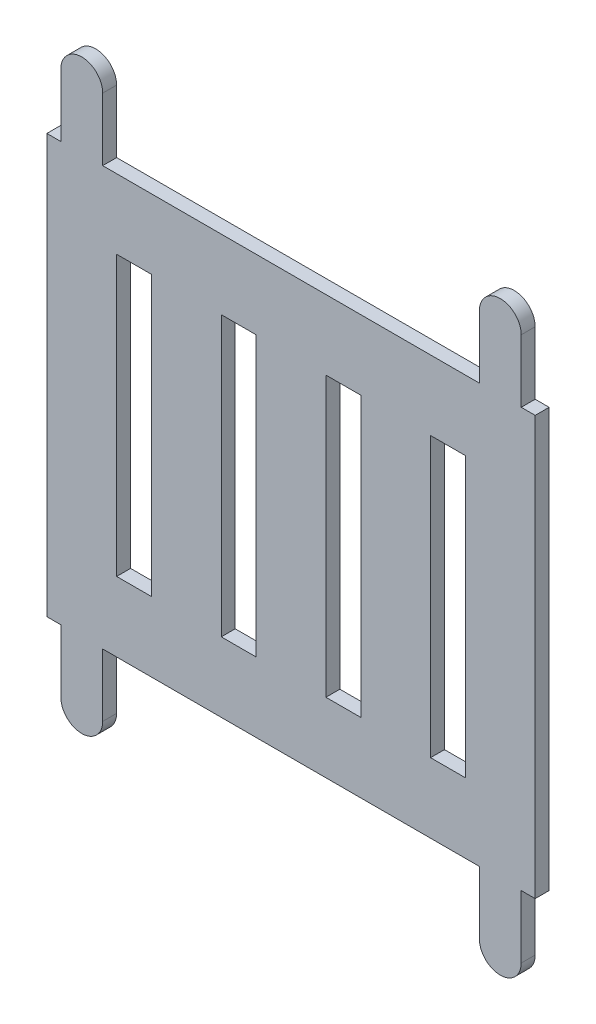
ISO-10303-21;
HEADER;
FILE_DESCRIPTION(('STEP AP214'),'2;1');
FILE_NAME('part.step','',(''),(''),'','','');
FILE_SCHEMA(('AUTOMOTIVE_DESIGN { 1 0 10303 214 1 1 1 1 }'));
ENDSEC;
DATA;
#1=APPLICATION_CONTEXT('core data for automotive mechanical design processes');
#2=APPLICATION_PROTOCOL_DEFINITION('international standard','automotive_design',2000,#1);
#3=PRODUCT_CONTEXT('',#1,'mechanical');
#4=PRODUCT('Part','Part','',(#3));
#5=PRODUCT_RELATED_PRODUCT_CATEGORY('part','',(#4));
#6=PRODUCT_DEFINITION_FORMATION('','',#4);
#7=PRODUCT_DEFINITION_CONTEXT('part definition',#1,'design');
#8=PRODUCT_DEFINITION('design','',#6,#7);
#9=PRODUCT_DEFINITION_SHAPE('','',#8);
#10=(LENGTH_UNIT() NAMED_UNIT(*) SI_UNIT(.MILLI.,.METRE.));
#11=(NAMED_UNIT(*) PLANE_ANGLE_UNIT() SI_UNIT($,.RADIAN.));
#12=(NAMED_UNIT(*) SI_UNIT($,.STERADIAN.) SOLID_ANGLE_UNIT());
#13=UNCERTAINTY_MEASURE_WITH_UNIT(LENGTH_MEASURE(1.E-05),#10,'distance_accuracy_value','');
#14=(GEOMETRIC_REPRESENTATION_CONTEXT(3) GLOBAL_UNCERTAINTY_ASSIGNED_CONTEXT((#13)) GLOBAL_UNIT_ASSIGNED_CONTEXT((#10,
#11,#12)) REPRESENTATION_CONTEXT('',''));
#15=CARTESIAN_POINT('',(0.,0.,0.));
#16=DIRECTION('',(0.,0.,1.));
#17=DIRECTION('',(1.,0.,0.));
#18=AXIS2_PLACEMENT_3D('',#15,#16,#17);
#19=CARTESIAN_POINT('',(5.,69.,1.));
#20=DIRECTION('',(0.,0.,-1.));
#21=DIRECTION('',(-1.,0.,0.));
#22=AXIS2_PLACEMENT_3D('',#19,#20,#21);
#23=PLANE('',#22);
#24=DIRECTION('',(0.,-1.,0.));
#25=VECTOR('',#24,1.);
#26=CARTESIAN_POINT('',(55.,50.,1.));
#27=LINE('',#26,#25);
#28=CARTESIAN_POINT('',(55.,50.,1.));
#29=VERTEX_POINT('',#28);
#30=CARTESIAN_POINT('',(55.,10.,1.));
#31=VERTEX_POINT('',#30);
#32=EDGE_CURVE('E303',#29,#31,#27,.T.);
#33=ORIENTED_EDGE('',*,*,#32,.F.);
#34=DIRECTION('',(-1.,0.,0.));
#35=VECTOR('',#34,1.);
#36=CARTESIAN_POINT('',(55.,50.,1.));
#37=LINE('',#36,#35);
#38=CARTESIAN_POINT('',(60.,50.,1.));
#39=VERTEX_POINT('',#38);
#40=EDGE_CURVE('E311',#39,#29,#37,.T.);
#41=ORIENTED_EDGE('',*,*,#40,.F.);
#42=DIRECTION('',(0.,1.,0.));
#43=VECTOR('',#42,1.);
#44=CARTESIAN_POINT('',(60.,50.,1.));
#45=LINE('',#44,#43);
#46=CARTESIAN_POINT('',(60.,10.,1.));
#47=VERTEX_POINT('',#46);
#48=EDGE_CURVE('E308',#47,#39,#45,.T.);
#49=ORIENTED_EDGE('',*,*,#48,.F.);
#50=DIRECTION('',(1.,0.,0.));
#51=VECTOR('',#50,1.);
#52=CARTESIAN_POINT('',(55.,10.,1.));
#53=LINE('',#52,#51);
#54=EDGE_CURVE('E305',#31,#47,#53,.T.);
#55=ORIENTED_EDGE('',*,*,#54,.F.);
#56=EDGE_LOOP('',(#33,#41,#49,#55));
#57=FACE_BOUND('',#56,.T.);
#58=DIRECTION('',(0.,1.,0.));
#59=VECTOR('',#58,1.);
#60=CARTESIAN_POINT('',(30.,50.,1.));
#61=LINE('',#60,#59);
#62=CARTESIAN_POINT('',(30.,10.,1.));
#63=VERTEX_POINT('',#62);
#64=CARTESIAN_POINT('',(30.,50.,1.));
#65=VERTEX_POINT('',#64);
#66=EDGE_CURVE('E365',#63,#65,#61,.T.);
#67=ORIENTED_EDGE('',*,*,#66,.F.);
#68=DIRECTION('',(1.,0.,0.));
#69=VECTOR('',#68,1.);
#70=CARTESIAN_POINT('',(30.,10.,1.));
#71=LINE('',#70,#69);
#72=CARTESIAN_POINT('',(25.,10.,1.));
#73=VERTEX_POINT('',#72);
#74=EDGE_CURVE('E373',#73,#63,#71,.T.);
#75=ORIENTED_EDGE('',*,*,#74,.F.);
#76=DIRECTION('',(0.,-1.,0.));
#77=VECTOR('',#76,1.);
#78=CARTESIAN_POINT('',(25.,50.,1.));
#79=LINE('',#78,#77);
#80=CARTESIAN_POINT('',(25.,50.,1.));
#81=VERTEX_POINT('',#80);
#82=EDGE_CURVE('E370',#81,#73,#79,.T.);
#83=ORIENTED_EDGE('',*,*,#82,.F.);
#84=DIRECTION('',(-1.,0.,0.));
#85=VECTOR('',#84,1.);
#86=CARTESIAN_POINT('',(30.,50.,1.));
#87=LINE('',#86,#85);
#88=EDGE_CURVE('E367',#65,#81,#87,.T.);
#89=ORIENTED_EDGE('',*,*,#88,.F.);
#90=EDGE_LOOP('',(#67,#75,#83,#89));
#91=FACE_BOUND('',#90,.T.);
#92=DIRECTION('',(0.,-1.,0.));
#93=VECTOR('',#92,1.);
#94=CARTESIAN_POINT('',(0.,0.,1.));
#95=LINE('',#94,#93);
#96=CARTESIAN_POINT('',(0.,60.,1.));
#97=VERTEX_POINT('',#96);
#98=CARTESIAN_POINT('',(0.,0.,1.));
#99=VERTEX_POINT('',#98);
#100=EDGE_CURVE('E396',#97,#99,#95,.T.);
#101=ORIENTED_EDGE('',*,*,#100,.T.);
#102=DIRECTION('',(1.,0.,0.));
#103=VECTOR('',#102,1.);
#104=CARTESIAN_POINT('',(0.,0.,1.));
#105=LINE('',#104,#103);
#106=CARTESIAN_POINT('',(2.,0.,1.));
#107=VERTEX_POINT('',#106);
#108=EDGE_CURVE('E399',#99,#107,#105,.T.);
#109=ORIENTED_EDGE('',*,*,#108,.T.);
#110=DIRECTION('',(0.,-1.,0.));
#111=VECTOR('',#110,1.);
#112=CARTESIAN_POINT('',(2.,0.,1.));
#113=LINE('',#112,#111);
#114=CARTESIAN_POINT('',(2.,-9.,1.));
#115=VERTEX_POINT('',#114);
#116=EDGE_CURVE('E402',#107,#115,#113,.T.);
#117=ORIENTED_EDGE('',*,*,#116,.T.);
#118=CARTESIAN_POINT('',(5.,-9.,1.));
#119=DIRECTION('',(0.,0.,1.));
#120=DIRECTION('',(1.,0.,0.));
#121=AXIS2_PLACEMENT_3D('',#118,#119,#120);
#122=CIRCLE('',#121,3.);
#123=CARTESIAN_POINT('',(8.,-9.,1.));
#124=VERTEX_POINT('',#123);
#125=EDGE_CURVE('E404',#115,#124,#122,.T.);
#126=ORIENTED_EDGE('',*,*,#125,.T.);
#127=DIRECTION('',(0.,1.,0.));
#128=VECTOR('',#127,1.);
#129=CARTESIAN_POINT('',(8.,-9.,1.));
#130=LINE('',#129,#128);
#131=CARTESIAN_POINT('',(8.,0.,1.));
#132=VERTEX_POINT('',#131);
#133=EDGE_CURVE('E406',#124,#132,#130,.T.);
#134=ORIENTED_EDGE('',*,*,#133,.T.);
#135=DIRECTION('',(1.,0.,0.));
#136=VECTOR('',#135,1.);
#137=CARTESIAN_POINT('',(8.,0.,1.));
#138=LINE('',#137,#136);
#139=CARTESIAN_POINT('',(62.,0.,1.));
#140=VERTEX_POINT('',#139);
#141=EDGE_CURVE('E408',#132,#140,#138,.T.);
#142=ORIENTED_EDGE('',*,*,#141,.T.);
#143=DIRECTION('',(0.,-1.,0.));
#144=VECTOR('',#143,1.);
#145=CARTESIAN_POINT('',(62.,0.,1.));
#146=LINE('',#145,#144);
#147=CARTESIAN_POINT('',(62.,-9.,1.));
#148=VERTEX_POINT('',#147);
#149=EDGE_CURVE('E410',#140,#148,#146,.T.);
#150=ORIENTED_EDGE('',*,*,#149,.T.);
#151=CARTESIAN_POINT('',(65.,-8.99999999999999,1.));
#152=DIRECTION('',(0.,0.,1.));
#153=DIRECTION('',(1.,0.,0.));
#154=AXIS2_PLACEMENT_3D('',#151,#152,#153);
#155=CIRCLE('',#154,3.);
#156=CARTESIAN_POINT('',(68.,-8.99999999999999,1.));
#157=VERTEX_POINT('',#156);
#158=EDGE_CURVE('E412',#148,#157,#155,.T.);
#159=ORIENTED_EDGE('',*,*,#158,.T.);
#160=DIRECTION('',(0.,1.,0.));
#161=VECTOR('',#160,1.);
#162=CARTESIAN_POINT('',(68.,-9.,1.));
#163=LINE('',#162,#161);
#164=CARTESIAN_POINT('',(68.,0.,1.));
#165=VERTEX_POINT('',#164);
#166=EDGE_CURVE('E414',#157,#165,#163,.T.);
#167=ORIENTED_EDGE('',*,*,#166,.T.);
#168=DIRECTION('',(1.,0.,0.));
#169=VECTOR('',#168,1.);
#170=CARTESIAN_POINT('',(68.,0.,1.));
#171=LINE('',#170,#169);
#172=CARTESIAN_POINT('',(70.,0.,1.));
#173=VERTEX_POINT('',#172);
#174=EDGE_CURVE('E416',#165,#173,#171,.T.);
#175=ORIENTED_EDGE('',*,*,#174,.T.);
#176=DIRECTION('',(0.,1.,0.));
#177=VECTOR('',#176,1.);
#178=CARTESIAN_POINT('',(70.,0.,1.));
#179=LINE('',#178,#177);
#180=CARTESIAN_POINT('',(70.,60.,1.));
#181=VERTEX_POINT('',#180);
#182=EDGE_CURVE('E418',#173,#181,#179,.T.);
#183=ORIENTED_EDGE('',*,*,#182,.T.);
#184=DIRECTION('',(-1.,0.,0.));
#185=VECTOR('',#184,1.);
#186=CARTESIAN_POINT('',(68.,60.,1.));
#187=LINE('',#186,#185);
#188=CARTESIAN_POINT('',(68.,60.,1.));
#189=VERTEX_POINT('',#188);
#190=EDGE_CURVE('E420',#181,#189,#187,.T.);
#191=ORIENTED_EDGE('',*,*,#190,.T.);
#192=DIRECTION('',(0.,1.,0.));
#193=VECTOR('',#192,1.);
#194=CARTESIAN_POINT('',(68.,69.,1.));
#195=LINE('',#194,#193);
#196=CARTESIAN_POINT('',(68.,69.,1.));
#197=VERTEX_POINT('',#196);
#198=EDGE_CURVE('E422',#189,#197,#195,.T.);
#199=ORIENTED_EDGE('',*,*,#198,.T.);
#200=CARTESIAN_POINT('',(65.,69.,1.));
#201=DIRECTION('',(0.,0.,1.));
#202=DIRECTION('',(-1.,0.,0.));
#203=AXIS2_PLACEMENT_3D('',#200,#201,#202);
#204=CIRCLE('',#203,3.);
#205=CARTESIAN_POINT('',(62.,69.,1.));
#206=VERTEX_POINT('',#205);
#207=EDGE_CURVE('E424',#197,#206,#204,.T.);
#208=ORIENTED_EDGE('',*,*,#207,.T.);
#209=DIRECTION('',(0.,-1.,0.));
#210=VECTOR('',#209,1.);
#211=CARTESIAN_POINT('',(62.,60.,1.));
#212=LINE('',#211,#210);
#213=CARTESIAN_POINT('',(62.,60.,1.));
#214=VERTEX_POINT('',#213);
#215=EDGE_CURVE('E426',#206,#214,#212,.T.);
#216=ORIENTED_EDGE('',*,*,#215,.T.);
#217=DIRECTION('',(-1.,0.,0.));
#218=VECTOR('',#217,1.);
#219=CARTESIAN_POINT('',(8.,60.,1.));
#220=LINE('',#219,#218);
#221=CARTESIAN_POINT('',(8.,60.,1.));
#222=VERTEX_POINT('',#221);
#223=EDGE_CURVE('E428',#214,#222,#220,.T.);
#224=ORIENTED_EDGE('',*,*,#223,.T.);
#225=DIRECTION('',(0.,1.,0.));
#226=VECTOR('',#225,1.);
#227=CARTESIAN_POINT('',(8.,69.,1.));
#228=LINE('',#227,#226);
#229=CARTESIAN_POINT('',(8.,69.,1.));
#230=VERTEX_POINT('',#229);
#231=EDGE_CURVE('E430',#222,#230,#228,.T.);
#232=ORIENTED_EDGE('',*,*,#231,.T.);
#233=CARTESIAN_POINT('',(5.,69.,1.));
#234=DIRECTION('',(0.,0.,1.));
#235=DIRECTION('',(-1.,0.,0.));
#236=AXIS2_PLACEMENT_3D('',#233,#234,#235);
#237=CIRCLE('',#236,3.);
#238=CARTESIAN_POINT('',(2.,69.,1.));
#239=VERTEX_POINT('',#238);
#240=EDGE_CURVE('E432',#230,#239,#237,.T.);
#241=ORIENTED_EDGE('',*,*,#240,.T.);
#242=DIRECTION('',(0.,-1.,0.));
#243=VECTOR('',#242,1.);
#244=CARTESIAN_POINT('',(2.,60.,1.));
#245=LINE('',#244,#243);
#246=CARTESIAN_POINT('',(2.,60.,1.));
#247=VERTEX_POINT('',#246);
#248=EDGE_CURVE('E434',#239,#247,#245,.T.);
#249=ORIENTED_EDGE('',*,*,#248,.T.);
#250=DIRECTION('',(-1.,0.,0.));
#251=VECTOR('',#250,1.);
#252=CARTESIAN_POINT('',(0.,60.,1.));
#253=LINE('',#252,#251);
#254=EDGE_CURVE('E436',#247,#97,#253,.T.);
#255=ORIENTED_EDGE('',*,*,#254,.T.);
#256=EDGE_LOOP('',(#101,#109,#117,#126,#134,#142,#150,#159,#167,#175,#183,#191,#199,#208,#216,
#224,#232,#241,#249,#255));
#257=FACE_BOUND('',#256,.T.);
#258=DIRECTION('',(0.,-1.,0.));
#259=VECTOR('',#258,1.);
#260=CARTESIAN_POINT('',(40.,50.,1.));
#261=LINE('',#260,#259);
#262=CARTESIAN_POINT('',(40.,50.,1.));
#263=VERTEX_POINT('',#262);
#264=CARTESIAN_POINT('',(40.,10.,1.));
#265=VERTEX_POINT('',#264);
#266=EDGE_CURVE('E334',#263,#265,#261,.T.);
#267=ORIENTED_EDGE('',*,*,#266,.F.);
#268=DIRECTION('',(-1.,0.,0.));
#269=VECTOR('',#268,1.);
#270=CARTESIAN_POINT('',(40.,50.,1.));
#271=LINE('',#270,#269);
#272=CARTESIAN_POINT('',(45.,50.,1.));
#273=VERTEX_POINT('',#272);
#274=EDGE_CURVE('E342',#273,#263,#271,.T.);
#275=ORIENTED_EDGE('',*,*,#274,.F.);
#276=DIRECTION('',(0.,1.,0.));
#277=VECTOR('',#276,1.);
#278=CARTESIAN_POINT('',(45.,50.,1.));
#279=LINE('',#278,#277);
#280=CARTESIAN_POINT('',(45.,10.,1.));
#281=VERTEX_POINT('',#280);
#282=EDGE_CURVE('E339',#281,#273,#279,.T.);
#283=ORIENTED_EDGE('',*,*,#282,.F.);
#284=DIRECTION('',(1.,0.,0.));
#285=VECTOR('',#284,1.);
#286=CARTESIAN_POINT('',(40.,10.,1.));
#287=LINE('',#286,#285);
#288=EDGE_CURVE('E336',#265,#281,#287,.T.);
#289=ORIENTED_EDGE('',*,*,#288,.F.);
#290=EDGE_LOOP('',(#267,#275,#283,#289));
#291=FACE_BOUND('',#290,.T.);
#292=DIRECTION('',(0.,1.,0.));
#293=VECTOR('',#292,1.);
#294=CARTESIAN_POINT('',(15.,50.,1.));
#295=LINE('',#294,#293);
#296=CARTESIAN_POINT('',(15.,10.,1.));
#297=VERTEX_POINT('',#296);
#298=CARTESIAN_POINT('',(15.,50.,1.));
#299=VERTEX_POINT('',#298);
#300=EDGE_CURVE('E267',#297,#299,#295,.T.);
#301=ORIENTED_EDGE('',*,*,#300,.F.);
#302=DIRECTION('',(1.,0.,0.));
#303=VECTOR('',#302,1.);
#304=CARTESIAN_POINT('',(15.,10.,1.));
#305=LINE('',#304,#303);
#306=CARTESIAN_POINT('',(10.,10.,1.));
#307=VERTEX_POINT('',#306);
#308=EDGE_CURVE('E289',#307,#297,#305,.T.);
#309=ORIENTED_EDGE('',*,*,#308,.F.);
#310=DIRECTION('',(0.,-1.,0.));
#311=VECTOR('',#310,1.);
#312=CARTESIAN_POINT('',(10.,50.,1.));
#313=LINE('',#312,#311);
#314=CARTESIAN_POINT('',(10.,50.,1.));
#315=VERTEX_POINT('',#314);
#316=EDGE_CURVE('E287',#315,#307,#313,.T.);
#317=ORIENTED_EDGE('',*,*,#316,.F.);
#318=DIRECTION('',(-1.,0.,0.));
#319=VECTOR('',#318,1.);
#320=CARTESIAN_POINT('',(15.,50.,1.));
#321=LINE('',#320,#319);
#322=EDGE_CURVE('E275',#299,#315,#321,.T.);
#323=ORIENTED_EDGE('',*,*,#322,.F.);
#324=EDGE_LOOP('',(#301,#309,#317,#323));
#325=FACE_BOUND('',#324,.T.);
#326=ADVANCED_FACE('F34',(#57,#91,#257,#291,#325),#23,.F.);
#327=CARTESIAN_POINT('',(5.,69.,-1.));
#328=DIRECTION('',(0.,0.,-1.));
#329=DIRECTION('',(-1.,0.,0.));
#330=AXIS2_PLACEMENT_3D('',#327,#328,#329);
#331=PLANE('',#330);
#332=DIRECTION('',(0.,-1.,0.));
#333=VECTOR('',#332,1.);
#334=CARTESIAN_POINT('',(0.,0.,-1.));
#335=LINE('',#334,#333);
#336=CARTESIAN_POINT('',(0.,60.,-1.));
#337=VERTEX_POINT('',#336);
#338=CARTESIAN_POINT('',(0.,0.,-1.));
#339=VERTEX_POINT('',#338);
#340=EDGE_CURVE('E395',#337,#339,#335,.T.);
#341=ORIENTED_EDGE('',*,*,#340,.F.);
#342=DIRECTION('',(-1.,0.,0.));
#343=VECTOR('',#342,1.);
#344=CARTESIAN_POINT('',(0.,60.,-1.));
#345=LINE('',#344,#343);
#346=CARTESIAN_POINT('',(2.,60.,-1.));
#347=VERTEX_POINT('',#346);
#348=EDGE_CURVE('E400',#347,#337,#345,.T.);
#349=ORIENTED_EDGE('',*,*,#348,.F.);
#350=DIRECTION('',(0.,-1.,0.));
#351=VECTOR('',#350,1.);
#352=CARTESIAN_POINT('',(2.,60.,-1.));
#353=LINE('',#352,#351);
#354=CARTESIAN_POINT('',(2.,69.,-1.));
#355=VERTEX_POINT('',#354);
#356=EDGE_CURVE('E475',#355,#347,#353,.T.);
#357=ORIENTED_EDGE('',*,*,#356,.F.);
#358=CARTESIAN_POINT('',(5.,69.,-1.));
#359=DIRECTION('',(0.,0.,1.));
#360=DIRECTION('',(-1.,0.,0.));
#361=AXIS2_PLACEMENT_3D('',#358,#359,#360);
#362=CIRCLE('',#361,3.);
#363=CARTESIAN_POINT('',(8.,69.,-1.));
#364=VERTEX_POINT('',#363);
#365=EDGE_CURVE('E473',#364,#355,#362,.T.);
#366=ORIENTED_EDGE('',*,*,#365,.F.);
#367=DIRECTION('',(0.,1.,0.));
#368=VECTOR('',#367,1.);
#369=CARTESIAN_POINT('',(8.,69.,-1.));
#370=LINE('',#369,#368);
#371=CARTESIAN_POINT('',(8.,60.,-1.));
#372=VERTEX_POINT('',#371);
#373=EDGE_CURVE('E471',#372,#364,#370,.T.);
#374=ORIENTED_EDGE('',*,*,#373,.F.);
#375=DIRECTION('',(-1.,0.,0.));
#376=VECTOR('',#375,1.);
#377=CARTESIAN_POINT('',(8.,60.,-1.));
#378=LINE('',#377,#376);
#379=CARTESIAN_POINT('',(62.,60.,-1.));
#380=VERTEX_POINT('',#379);
#381=EDGE_CURVE('E469',#380,#372,#378,.T.);
#382=ORIENTED_EDGE('',*,*,#381,.F.);
#383=DIRECTION('',(0.,-1.,0.));
#384=VECTOR('',#383,1.);
#385=CARTESIAN_POINT('',(62.,60.,-1.));
#386=LINE('',#385,#384);
#387=CARTESIAN_POINT('',(62.,69.,-1.));
#388=VERTEX_POINT('',#387);
#389=EDGE_CURVE('E467',#388,#380,#386,.T.);
#390=ORIENTED_EDGE('',*,*,#389,.F.);
#391=CARTESIAN_POINT('',(65.,69.,-1.));
#392=DIRECTION('',(0.,0.,1.));
#393=DIRECTION('',(-1.,0.,0.));
#394=AXIS2_PLACEMENT_3D('',#391,#392,#393);
#395=CIRCLE('',#394,3.);
#396=CARTESIAN_POINT('',(68.,69.,-1.));
#397=VERTEX_POINT('',#396);
#398=EDGE_CURVE('E465',#397,#388,#395,.T.);
#399=ORIENTED_EDGE('',*,*,#398,.F.);
#400=DIRECTION('',(0.,1.,0.));
#401=VECTOR('',#400,1.);
#402=CARTESIAN_POINT('',(68.,69.,-1.));
#403=LINE('',#402,#401);
#404=CARTESIAN_POINT('',(68.,60.,-1.));
#405=VERTEX_POINT('',#404);
#406=EDGE_CURVE('E463',#405,#397,#403,.T.);
#407=ORIENTED_EDGE('',*,*,#406,.F.);
#408=DIRECTION('',(-1.,0.,0.));
#409=VECTOR('',#408,1.);
#410=CARTESIAN_POINT('',(68.,60.,-1.));
#411=LINE('',#410,#409);
#412=CARTESIAN_POINT('',(70.,60.,-1.));
#413=VERTEX_POINT('',#412);
#414=EDGE_CURVE('E461',#413,#405,#411,.T.);
#415=ORIENTED_EDGE('',*,*,#414,.F.);
#416=DIRECTION('',(0.,1.,0.));
#417=VECTOR('',#416,1.);
#418=CARTESIAN_POINT('',(70.,0.,-1.));
#419=LINE('',#418,#417);
#420=CARTESIAN_POINT('',(70.,0.,-1.));
#421=VERTEX_POINT('',#420);
#422=EDGE_CURVE('E459',#421,#413,#419,.T.);
#423=ORIENTED_EDGE('',*,*,#422,.F.);
#424=DIRECTION('',(1.,0.,0.));
#425=VECTOR('',#424,1.);
#426=CARTESIAN_POINT('',(68.,0.,-1.));
#427=LINE('',#426,#425);
#428=CARTESIAN_POINT('',(68.,0.,-1.));
#429=VERTEX_POINT('',#428);
#430=EDGE_CURVE('E457',#429,#421,#427,.T.);
#431=ORIENTED_EDGE('',*,*,#430,.F.);
#432=DIRECTION('',(0.,1.,0.));
#433=VECTOR('',#432,1.);
#434=CARTESIAN_POINT('',(68.,-9.,-1.));
#435=LINE('',#434,#433);
#436=CARTESIAN_POINT('',(68.,-8.99999999999999,-1.));
#437=VERTEX_POINT('',#436);
#438=EDGE_CURVE('E455',#437,#429,#435,.T.);
#439=ORIENTED_EDGE('',*,*,#438,.F.);
#440=CARTESIAN_POINT('',(65.,-8.99999999999999,-1.));
#441=DIRECTION('',(0.,0.,1.));
#442=DIRECTION('',(1.,0.,0.));
#443=AXIS2_PLACEMENT_3D('',#440,#441,#442);
#444=CIRCLE('',#443,3.);
#445=CARTESIAN_POINT('',(62.,-9.,-1.));
#446=VERTEX_POINT('',#445);
#447=EDGE_CURVE('E453',#446,#437,#444,.T.);
#448=ORIENTED_EDGE('',*,*,#447,.F.);
#449=DIRECTION('',(0.,-1.,0.));
#450=VECTOR('',#449,1.);
#451=CARTESIAN_POINT('',(62.,0.,-1.));
#452=LINE('',#451,#450);
#453=CARTESIAN_POINT('',(62.,0.,-1.));
#454=VERTEX_POINT('',#453);
#455=EDGE_CURVE('E451',#454,#446,#452,.T.);
#456=ORIENTED_EDGE('',*,*,#455,.F.);
#457=DIRECTION('',(1.,0.,0.));
#458=VECTOR('',#457,1.);
#459=CARTESIAN_POINT('',(8.,0.,-1.));
#460=LINE('',#459,#458);
#461=CARTESIAN_POINT('',(8.,0.,-1.));
#462=VERTEX_POINT('',#461);
#463=EDGE_CURVE('E449',#462,#454,#460,.T.);
#464=ORIENTED_EDGE('',*,*,#463,.F.);
#465=DIRECTION('',(0.,1.,0.));
#466=VECTOR('',#465,1.);
#467=CARTESIAN_POINT('',(8.,-9.,-1.));
#468=LINE('',#467,#466);
#469=CARTESIAN_POINT('',(8.,-9.,-1.));
#470=VERTEX_POINT('',#469);
#471=EDGE_CURVE('E447',#470,#462,#468,.T.);
#472=ORIENTED_EDGE('',*,*,#471,.F.);
#473=CARTESIAN_POINT('',(5.,-9.,-1.));
#474=DIRECTION('',(0.,0.,1.));
#475=DIRECTION('',(1.,0.,0.));
#476=AXIS2_PLACEMENT_3D('',#473,#474,#475);
#477=CIRCLE('',#476,3.);
#478=CARTESIAN_POINT('',(2.,-9.,-1.));
#479=VERTEX_POINT('',#478);
#480=EDGE_CURVE('E445',#479,#470,#477,.T.);
#481=ORIENTED_EDGE('',*,*,#480,.F.);
#482=DIRECTION('',(0.,-1.,0.));
#483=VECTOR('',#482,1.);
#484=CARTESIAN_POINT('',(2.,0.,-1.));
#485=LINE('',#484,#483);
#486=CARTESIAN_POINT('',(2.,0.,-1.));
#487=VERTEX_POINT('',#486);
#488=EDGE_CURVE('E443',#487,#479,#485,.T.);
#489=ORIENTED_EDGE('',*,*,#488,.F.);
#490=DIRECTION('',(1.,0.,0.));
#491=VECTOR('',#490,1.);
#492=CARTESIAN_POINT('',(0.,0.,-1.));
#493=LINE('',#492,#491);
#494=EDGE_CURVE('E441',#339,#487,#493,.T.);
#495=ORIENTED_EDGE('',*,*,#494,.F.);
#496=EDGE_LOOP('',(#341,#349,#357,#366,#374,#382,#390,#399,#407,#415,#423,#431,#439,#448,#456,
#464,#472,#481,#489,#495));
#497=FACE_BOUND('',#496,.T.);
#498=DIRECTION('',(1.,0.,0.));
#499=VECTOR('',#498,1.);
#500=CARTESIAN_POINT('',(30.,10.,-1.));
#501=LINE('',#500,#499);
#502=CARTESIAN_POINT('',(25.,10.,-1.));
#503=VERTEX_POINT('',#502);
#504=CARTESIAN_POINT('',(30.,10.,-1.));
#505=VERTEX_POINT('',#504);
#506=EDGE_CURVE('E368',#503,#505,#501,.T.);
#507=ORIENTED_EDGE('',*,*,#506,.T.);
#508=DIRECTION('',(0.,1.,0.));
#509=VECTOR('',#508,1.);
#510=CARTESIAN_POINT('',(30.,50.,-1.));
#511=LINE('',#510,#509);
#512=CARTESIAN_POINT('',(30.,50.,-1.));
#513=VERTEX_POINT('',#512);
#514=EDGE_CURVE('E364',#505,#513,#511,.T.);
#515=ORIENTED_EDGE('',*,*,#514,.T.);
#516=DIRECTION('',(-1.,0.,0.));
#517=VECTOR('',#516,1.);
#518=CARTESIAN_POINT('',(30.,50.,-1.));
#519=LINE('',#518,#517);
#520=CARTESIAN_POINT('',(25.,50.,-1.));
#521=VERTEX_POINT('',#520);
#522=EDGE_CURVE('E378',#513,#521,#519,.T.);
#523=ORIENTED_EDGE('',*,*,#522,.T.);
#524=DIRECTION('',(0.,-1.,0.));
#525=VECTOR('',#524,1.);
#526=CARTESIAN_POINT('',(25.,50.,-1.));
#527=LINE('',#526,#525);
#528=EDGE_CURVE('E381',#521,#503,#527,.T.);
#529=ORIENTED_EDGE('',*,*,#528,.T.);
#530=EDGE_LOOP('',(#507,#515,#523,#529));
#531=FACE_BOUND('',#530,.T.);
#532=DIRECTION('',(-1.,0.,0.));
#533=VECTOR('',#532,1.);
#534=CARTESIAN_POINT('',(40.,50.,-1.));
#535=LINE('',#534,#533);
#536=CARTESIAN_POINT('',(45.,50.,-1.));
#537=VERTEX_POINT('',#536);
#538=CARTESIAN_POINT('',(40.,50.,-1.));
#539=VERTEX_POINT('',#538);
#540=EDGE_CURVE('E337',#537,#539,#535,.T.);
#541=ORIENTED_EDGE('',*,*,#540,.T.);
#542=DIRECTION('',(0.,-1.,0.));
#543=VECTOR('',#542,1.);
#544=CARTESIAN_POINT('',(40.,50.,-1.));
#545=LINE('',#544,#543);
#546=CARTESIAN_POINT('',(40.,10.,-1.));
#547=VERTEX_POINT('',#546);
#548=EDGE_CURVE('E333',#539,#547,#545,.T.);
#549=ORIENTED_EDGE('',*,*,#548,.T.);
#550=DIRECTION('',(1.,0.,0.));
#551=VECTOR('',#550,1.);
#552=CARTESIAN_POINT('',(40.,10.,-1.));
#553=LINE('',#552,#551);
#554=CARTESIAN_POINT('',(45.,10.,-1.));
#555=VERTEX_POINT('',#554);
#556=EDGE_CURVE('E347',#547,#555,#553,.T.);
#557=ORIENTED_EDGE('',*,*,#556,.T.);
#558=DIRECTION('',(0.,1.,0.));
#559=VECTOR('',#558,1.);
#560=CARTESIAN_POINT('',(45.,50.,-1.));
#561=LINE('',#560,#559);
#562=EDGE_CURVE('E350',#555,#537,#561,.T.);
#563=ORIENTED_EDGE('',*,*,#562,.T.);
#564=EDGE_LOOP('',(#541,#549,#557,#563));
#565=FACE_BOUND('',#564,.T.);
#566=DIRECTION('',(-1.,0.,0.));
#567=VECTOR('',#566,1.);
#568=CARTESIAN_POINT('',(55.,50.,-1.));
#569=LINE('',#568,#567);
#570=CARTESIAN_POINT('',(60.,50.,-1.));
#571=VERTEX_POINT('',#570);
#572=CARTESIAN_POINT('',(55.,50.,-1.));
#573=VERTEX_POINT('',#572);
#574=EDGE_CURVE('E306',#571,#573,#569,.T.);
#575=ORIENTED_EDGE('',*,*,#574,.T.);
#576=DIRECTION('',(0.,-1.,0.));
#577=VECTOR('',#576,1.);
#578=CARTESIAN_POINT('',(55.,50.,-1.));
#579=LINE('',#578,#577);
#580=CARTESIAN_POINT('',(55.,10.,-1.));
#581=VERTEX_POINT('',#580);
#582=EDGE_CURVE('E283',#573,#581,#579,.T.);
#583=ORIENTED_EDGE('',*,*,#582,.T.);
#584=DIRECTION('',(1.,0.,0.));
#585=VECTOR('',#584,1.);
#586=CARTESIAN_POINT('',(55.,10.,-1.));
#587=LINE('',#586,#585);
#588=CARTESIAN_POINT('',(60.,10.,-1.));
#589=VERTEX_POINT('',#588);
#590=EDGE_CURVE('E316',#581,#589,#587,.T.);
#591=ORIENTED_EDGE('',*,*,#590,.T.);
#592=DIRECTION('',(0.,1.,0.));
#593=VECTOR('',#592,1.);
#594=CARTESIAN_POINT('',(60.,50.,-1.));
#595=LINE('',#594,#593);
#596=EDGE_CURVE('E319',#589,#571,#595,.T.);
#597=ORIENTED_EDGE('',*,*,#596,.T.);
#598=EDGE_LOOP('',(#575,#583,#591,#597));
#599=FACE_BOUND('',#598,.T.);
#600=DIRECTION('',(1.,0.,0.));
#601=VECTOR('',#600,1.);
#602=CARTESIAN_POINT('',(15.,10.,-1.));
#603=LINE('',#602,#601);
#604=CARTESIAN_POINT('',(10.,10.,-1.));
#605=VERTEX_POINT('',#604);
#606=CARTESIAN_POINT('',(15.,10.,-1.));
#607=VERTEX_POINT('',#606);
#608=EDGE_CURVE('E276',#605,#607,#603,.T.);
#609=ORIENTED_EDGE('',*,*,#608,.T.);
#610=DIRECTION('',(0.,1.,0.));
#611=VECTOR('',#610,1.);
#612=CARTESIAN_POINT('',(15.,50.,-1.));
#613=LINE('',#612,#611);
#614=CARTESIAN_POINT('',(15.,50.,-1.));
#615=VERTEX_POINT('',#614);
#616=EDGE_CURVE('E57',#607,#615,#613,.T.);
#617=ORIENTED_EDGE('',*,*,#616,.T.);
#618=DIRECTION('',(-1.,0.,0.));
#619=VECTOR('',#618,1.);
#620=CARTESIAN_POINT('',(15.,50.,-1.));
#621=LINE('',#620,#619);
#622=CARTESIAN_POINT('',(10.,50.,-1.));
#623=VERTEX_POINT('',#622);
#624=EDGE_CURVE('E282',#615,#623,#621,.T.);
#625=ORIENTED_EDGE('',*,*,#624,.T.);
#626=DIRECTION('',(0.,-1.,0.));
#627=VECTOR('',#626,1.);
#628=CARTESIAN_POINT('',(10.,50.,-1.));
#629=LINE('',#628,#627);
#630=EDGE_CURVE('E295',#623,#605,#629,.T.);
#631=ORIENTED_EDGE('',*,*,#630,.T.);
#632=EDGE_LOOP('',(#609,#617,#625,#631));
#633=FACE_BOUND('',#632,.T.);
#634=ADVANCED_FACE('F541',(#497,#531,#565,#599,#633),#331,.T.);
#635=CARTESIAN_POINT('',(0.,0.,1.));
#636=DIRECTION('',(1.,0.,0.));
#637=DIRECTION('',(0.,0.,-1.));
#638=AXIS2_PLACEMENT_3D('',#635,#636,#637);
#639=PLANE('',#638);
#640=ORIENTED_EDGE('',*,*,#340,.T.);
#641=DIRECTION('',(0.,0.,-1.));
#642=VECTOR('',#641,1.);
#643=CARTESIAN_POINT('',(0.,0.,1.));
#644=LINE('',#643,#642);
#645=EDGE_CURVE('E11',#99,#339,#644,.T.);
#646=ORIENTED_EDGE('',*,*,#645,.F.);
#647=ORIENTED_EDGE('',*,*,#100,.F.);
#648=DIRECTION('',(0.,0.,-1.));
#649=VECTOR('',#648,1.);
#650=CARTESIAN_POINT('',(0.,60.,1.));
#651=LINE('',#650,#649);
#652=EDGE_CURVE('E438',#97,#337,#651,.T.);
#653=ORIENTED_EDGE('',*,*,#652,.T.);
#654=EDGE_LOOP('',(#640,#646,#647,#653));
#655=FACE_BOUND('',#654,.T.);
#656=ADVANCED_FACE('F36',(#655),#639,.F.);
#657=CARTESIAN_POINT('',(0.,0.,1.));
#658=DIRECTION('',(0.,1.,0.));
#659=DIRECTION('',(0.,0.,1.));
#660=AXIS2_PLACEMENT_3D('',#657,#658,#659);
#661=PLANE('',#660);
#662=ORIENTED_EDGE('',*,*,#494,.T.);
#663=DIRECTION('',(0.,0.,-1.));
#664=VECTOR('',#663,1.);
#665=CARTESIAN_POINT('',(2.,0.,1.));
#666=LINE('',#665,#664);
#667=EDGE_CURVE('E42',#107,#487,#666,.T.);
#668=ORIENTED_EDGE('',*,*,#667,.F.);
#669=ORIENTED_EDGE('',*,*,#108,.F.);
#670=ORIENTED_EDGE('',*,*,#645,.T.);
#671=EDGE_LOOP('',(#662,#668,#669,#670));
#672=FACE_BOUND('',#671,.T.);
#673=ADVANCED_FACE('F559',(#672),#661,.F.);
#674=CARTESIAN_POINT('',(2.,0.,1.));
#675=DIRECTION('',(1.,0.,0.));
#676=DIRECTION('',(0.,1.,0.));
#677=AXIS2_PLACEMENT_3D('',#674,#675,#676);
#678=PLANE('',#677);
#679=ORIENTED_EDGE('',*,*,#488,.T.);
#680=DIRECTION('',(0.,0.,-1.));
#681=VECTOR('',#680,1.);
#682=CARTESIAN_POINT('',(2.,-9.,1.));
#683=LINE('',#682,#681);
#684=EDGE_CURVE('E528',#115,#479,#683,.T.);
#685=ORIENTED_EDGE('',*,*,#684,.F.);
#686=ORIENTED_EDGE('',*,*,#116,.F.);
#687=ORIENTED_EDGE('',*,*,#667,.T.);
#688=EDGE_LOOP('',(#679,#685,#686,#687));
#689=FACE_BOUND('',#688,.T.);
#690=ADVANCED_FACE('F535',(#689),#678,.F.);
#691=CARTESIAN_POINT('',(5.,-9.,1.));
#692=DIRECTION('',(0.,0.,-1.));
#693=DIRECTION('',(-1.,0.,0.));
#694=AXIS2_PLACEMENT_3D('',#691,#692,#693);
#695=CYLINDRICAL_SURFACE('',#694,3.);
#696=ORIENTED_EDGE('',*,*,#480,.T.);
#697=DIRECTION('',(0.,0.,-1.));
#698=VECTOR('',#697,1.);
#699=CARTESIAN_POINT('',(8.,-9.,1.));
#700=LINE('',#699,#698);
#701=EDGE_CURVE('E525',#124,#470,#700,.T.);
#702=ORIENTED_EDGE('',*,*,#701,.F.);
#703=ORIENTED_EDGE('',*,*,#125,.F.);
#704=ORIENTED_EDGE('',*,*,#684,.T.);
#705=EDGE_LOOP('',(#696,#702,#703,#704));
#706=FACE_BOUND('',#705,.T.);
#707=ADVANCED_FACE('F547',(#706),#695,.T.);
#708=CARTESIAN_POINT('',(8.,-9.,1.));
#709=DIRECTION('',(-1.,0.,0.));
#710=DIRECTION('',(0.,0.,1.));
#711=AXIS2_PLACEMENT_3D('',#708,#709,#710);
#712=PLANE('',#711);
#713=ORIENTED_EDGE('',*,*,#471,.T.);
#714=DIRECTION('',(0.,0.,-1.));
#715=VECTOR('',#714,1.);
#716=CARTESIAN_POINT('',(8.,0.,1.));
#717=LINE('',#716,#715);
#718=EDGE_CURVE('E522',#132,#462,#717,.T.);
#719=ORIENTED_EDGE('',*,*,#718,.F.);
#720=ORIENTED_EDGE('',*,*,#133,.F.);
#721=ORIENTED_EDGE('',*,*,#701,.T.);
#722=EDGE_LOOP('',(#713,#719,#720,#721));
#723=FACE_BOUND('',#722,.T.);
#724=ADVANCED_FACE('F551',(#723),#712,.F.);
#725=CARTESIAN_POINT('',(8.,0.,1.));
#726=DIRECTION('',(0.,1.,0.));
#727=DIRECTION('',(0.,0.,1.));
#728=AXIS2_PLACEMENT_3D('',#725,#726,#727);
#729=PLANE('',#728);
#730=ORIENTED_EDGE('',*,*,#463,.T.);
#731=DIRECTION('',(0.,0.,-1.));
#732=VECTOR('',#731,1.);
#733=CARTESIAN_POINT('',(62.,0.,1.));
#734=LINE('',#733,#732);
#735=EDGE_CURVE('E519',#140,#454,#734,.T.);
#736=ORIENTED_EDGE('',*,*,#735,.F.);
#737=ORIENTED_EDGE('',*,*,#141,.F.);
#738=ORIENTED_EDGE('',*,*,#718,.T.);
#739=EDGE_LOOP('',(#730,#736,#737,#738));
#740=FACE_BOUND('',#739,.T.);
#741=ADVANCED_FACE('F632',(#740),#729,.F.);
#742=CARTESIAN_POINT('',(62.,0.,1.));
#743=DIRECTION('',(1.,0.,0.));
#744=DIRECTION('',(0.,0.,-1.));
#745=AXIS2_PLACEMENT_3D('',#742,#743,#744);
#746=PLANE('',#745);
#747=ORIENTED_EDGE('',*,*,#455,.T.);
#748=DIRECTION('',(0.,0.,-1.));
#749=VECTOR('',#748,1.);
#750=CARTESIAN_POINT('',(62.,-9.,1.));
#751=LINE('',#750,#749);
#752=EDGE_CURVE('E516',#148,#446,#751,.T.);
#753=ORIENTED_EDGE('',*,*,#752,.F.);
#754=ORIENTED_EDGE('',*,*,#149,.F.);
#755=ORIENTED_EDGE('',*,*,#735,.T.);
#756=EDGE_LOOP('',(#747,#753,#754,#755));
#757=FACE_BOUND('',#756,.T.);
#758=ADVANCED_FACE('F630',(#757),#746,.F.);
#759=CARTESIAN_POINT('',(65.,-8.99999999999999,1.));
#760=DIRECTION('',(0.,0.,-1.));
#761=DIRECTION('',(-1.,0.,0.));
#762=AXIS2_PLACEMENT_3D('',#759,#760,#761);
#763=CYLINDRICAL_SURFACE('',#762,3.);
#764=ORIENTED_EDGE('',*,*,#447,.T.);
#765=DIRECTION('',(0.,0.,-1.));
#766=VECTOR('',#765,1.);
#767=CARTESIAN_POINT('',(68.,-8.99999999999999,1.));
#768=LINE('',#767,#766);
#769=EDGE_CURVE('E513',#157,#437,#768,.T.);
#770=ORIENTED_EDGE('',*,*,#769,.F.);
#771=ORIENTED_EDGE('',*,*,#158,.F.);
#772=ORIENTED_EDGE('',*,*,#752,.T.);
#773=EDGE_LOOP('',(#764,#770,#771,#772));
#774=FACE_BOUND('',#773,.T.);
#775=ADVANCED_FACE('F625',(#774),#763,.T.);
#776=CARTESIAN_POINT('',(68.,-9.,1.));
#777=DIRECTION('',(-1.,0.,0.));
#778=DIRECTION('',(0.,0.,1.));
#779=AXIS2_PLACEMENT_3D('',#776,#777,#778);
#780=PLANE('',#779);
#781=ORIENTED_EDGE('',*,*,#438,.T.);
#782=DIRECTION('',(0.,0.,-1.));
#783=VECTOR('',#782,1.);
#784=CARTESIAN_POINT('',(68.,0.,1.));
#785=LINE('',#784,#783);
#786=EDGE_CURVE('E510',#165,#429,#785,.T.);
#787=ORIENTED_EDGE('',*,*,#786,.F.);
#788=ORIENTED_EDGE('',*,*,#166,.F.);
#789=ORIENTED_EDGE('',*,*,#769,.T.);
#790=EDGE_LOOP('',(#781,#787,#788,#789));
#791=FACE_BOUND('',#790,.T.);
#792=ADVANCED_FACE('F620',(#791),#780,.F.);
#793=CARTESIAN_POINT('',(68.,0.,1.));
#794=DIRECTION('',(0.,1.,0.));
#795=DIRECTION('',(0.,0.,1.));
#796=AXIS2_PLACEMENT_3D('',#793,#794,#795);
#797=PLANE('',#796);
#798=ORIENTED_EDGE('',*,*,#430,.T.);
#799=DIRECTION('',(0.,0.,-1.));
#800=VECTOR('',#799,1.);
#801=CARTESIAN_POINT('',(70.,0.,1.));
#802=LINE('',#801,#800);
#803=EDGE_CURVE('E507',#173,#421,#802,.T.);
#804=ORIENTED_EDGE('',*,*,#803,.F.);
#805=ORIENTED_EDGE('',*,*,#174,.F.);
#806=ORIENTED_EDGE('',*,*,#786,.T.);
#807=EDGE_LOOP('',(#798,#804,#805,#806));
#808=FACE_BOUND('',#807,.T.);
#809=ADVANCED_FACE('F616',(#808),#797,.F.);
#810=CARTESIAN_POINT('',(70.,0.,1.));
#811=DIRECTION('',(-1.,0.,0.));
#812=DIRECTION('',(0.,0.,1.));
#813=AXIS2_PLACEMENT_3D('',#810,#811,#812);
#814=PLANE('',#813);
#815=ORIENTED_EDGE('',*,*,#422,.T.);
#816=DIRECTION('',(0.,0.,-1.));
#817=VECTOR('',#816,1.);
#818=CARTESIAN_POINT('',(70.,60.,1.));
#819=LINE('',#818,#817);
#820=EDGE_CURVE('E504',#181,#413,#819,.T.);
#821=ORIENTED_EDGE('',*,*,#820,.F.);
#822=ORIENTED_EDGE('',*,*,#182,.F.);
#823=ORIENTED_EDGE('',*,*,#803,.T.);
#824=EDGE_LOOP('',(#815,#821,#822,#823));
#825=FACE_BOUND('',#824,.T.);
#826=ADVANCED_FACE('F611',(#825),#814,.F.);
#827=CARTESIAN_POINT('',(68.,60.,1.));
#828=DIRECTION('',(0.,-1.,0.));
#829=DIRECTION('',(0.,0.,-1.));
#830=AXIS2_PLACEMENT_3D('',#827,#828,#829);
#831=PLANE('',#830);
#832=ORIENTED_EDGE('',*,*,#414,.T.);
#833=DIRECTION('',(0.,0.,-1.));
#834=VECTOR('',#833,1.);
#835=CARTESIAN_POINT('',(68.,60.,1.));
#836=LINE('',#835,#834);
#837=EDGE_CURVE('E501',#189,#405,#836,.T.);
#838=ORIENTED_EDGE('',*,*,#837,.F.);
#839=ORIENTED_EDGE('',*,*,#190,.F.);
#840=ORIENTED_EDGE('',*,*,#820,.T.);
#841=EDGE_LOOP('',(#832,#838,#839,#840));
#842=FACE_BOUND('',#841,.T.);
#843=ADVANCED_FACE('F605',(#842),#831,.F.);
#844=CARTESIAN_POINT('',(68.,69.,1.));
#845=DIRECTION('',(-1.,0.,0.));
#846=DIRECTION('',(0.,0.,1.));
#847=AXIS2_PLACEMENT_3D('',#844,#845,#846);
#848=PLANE('',#847);
#849=ORIENTED_EDGE('',*,*,#406,.T.);
#850=DIRECTION('',(0.,0.,-1.));
#851=VECTOR('',#850,1.);
#852=CARTESIAN_POINT('',(68.,69.,1.));
#853=LINE('',#852,#851);
#854=EDGE_CURVE('E498',#197,#397,#853,.T.);
#855=ORIENTED_EDGE('',*,*,#854,.F.);
#856=ORIENTED_EDGE('',*,*,#198,.F.);
#857=ORIENTED_EDGE('',*,*,#837,.T.);
#858=EDGE_LOOP('',(#849,#855,#856,#857));
#859=FACE_BOUND('',#858,.T.);
#860=ADVANCED_FACE('F601',(#859),#848,.F.);
#861=CARTESIAN_POINT('',(65.,69.,1.));
#862=DIRECTION('',(0.,0.,-1.));
#863=DIRECTION('',(-1.,0.,0.));
#864=AXIS2_PLACEMENT_3D('',#861,#862,#863);
#865=CYLINDRICAL_SURFACE('',#864,3.);
#866=ORIENTED_EDGE('',*,*,#398,.T.);
#867=DIRECTION('',(0.,0.,-1.));
#868=VECTOR('',#867,1.);
#869=CARTESIAN_POINT('',(62.,69.,1.));
#870=LINE('',#869,#868);
#871=EDGE_CURVE('E495',#206,#388,#870,.T.);
#872=ORIENTED_EDGE('',*,*,#871,.F.);
#873=ORIENTED_EDGE('',*,*,#207,.F.);
#874=ORIENTED_EDGE('',*,*,#854,.T.);
#875=EDGE_LOOP('',(#866,#872,#873,#874));
#876=FACE_BOUND('',#875,.T.);
#877=ADVANCED_FACE('F596',(#876),#865,.T.);
#878=CARTESIAN_POINT('',(62.,60.,1.));
#879=DIRECTION('',(1.,0.,0.));
#880=DIRECTION('',(0.,0.,-1.));
#881=AXIS2_PLACEMENT_3D('',#878,#879,#880);
#882=PLANE('',#881);
#883=ORIENTED_EDGE('',*,*,#389,.T.);
#884=DIRECTION('',(0.,0.,-1.));
#885=VECTOR('',#884,1.);
#886=CARTESIAN_POINT('',(62.,60.,1.));
#887=LINE('',#886,#885);
#888=EDGE_CURVE('E492',#214,#380,#887,.T.);
#889=ORIENTED_EDGE('',*,*,#888,.F.);
#890=ORIENTED_EDGE('',*,*,#215,.F.);
#891=ORIENTED_EDGE('',*,*,#871,.T.);
#892=EDGE_LOOP('',(#883,#889,#890,#891));
#893=FACE_BOUND('',#892,.T.);
#894=ADVANCED_FACE('F590',(#893),#882,.F.);
#895=CARTESIAN_POINT('',(8.,60.,1.));
#896=DIRECTION('',(0.,-1.,0.));
#897=DIRECTION('',(0.,0.,-1.));
#898=AXIS2_PLACEMENT_3D('',#895,#896,#897);
#899=PLANE('',#898);
#900=ORIENTED_EDGE('',*,*,#381,.T.);
#901=DIRECTION('',(0.,0.,-1.));
#902=VECTOR('',#901,1.);
#903=CARTESIAN_POINT('',(8.,60.,1.));
#904=LINE('',#903,#902);
#905=EDGE_CURVE('E489',#222,#372,#904,.T.);
#906=ORIENTED_EDGE('',*,*,#905,.F.);
#907=ORIENTED_EDGE('',*,*,#223,.F.);
#908=ORIENTED_EDGE('',*,*,#888,.T.);
#909=EDGE_LOOP('',(#900,#906,#907,#908));
#910=FACE_BOUND('',#909,.T.);
#911=ADVANCED_FACE('F586',(#910),#899,.F.);
#912=CARTESIAN_POINT('',(8.,69.,1.));
#913=DIRECTION('',(-1.,0.,0.));
#914=DIRECTION('',(0.,-1.,0.));
#915=AXIS2_PLACEMENT_3D('',#912,#913,#914);
#916=PLANE('',#915);
#917=ORIENTED_EDGE('',*,*,#373,.T.);
#918=DIRECTION('',(0.,0.,-1.));
#919=VECTOR('',#918,1.);
#920=CARTESIAN_POINT('',(8.,69.,1.));
#921=LINE('',#920,#919);
#922=EDGE_CURVE('E486',#230,#364,#921,.T.);
#923=ORIENTED_EDGE('',*,*,#922,.F.);
#924=ORIENTED_EDGE('',*,*,#231,.F.);
#925=ORIENTED_EDGE('',*,*,#905,.T.);
#926=EDGE_LOOP('',(#917,#923,#924,#925));
#927=FACE_BOUND('',#926,.T.);
#928=ADVANCED_FACE('F581',(#927),#916,.F.);
#929=CARTESIAN_POINT('',(5.,69.,1.));
#930=DIRECTION('',(0.,0.,-1.));
#931=DIRECTION('',(-1.,0.,0.));
#932=AXIS2_PLACEMENT_3D('',#929,#930,#931);
#933=CYLINDRICAL_SURFACE('',#932,3.);
#934=ORIENTED_EDGE('',*,*,#365,.T.);
#935=DIRECTION('',(0.,0.,-1.));
#936=VECTOR('',#935,1.);
#937=CARTESIAN_POINT('',(2.,69.,1.));
#938=LINE('',#937,#936);
#939=EDGE_CURVE('E483',#239,#355,#938,.T.);
#940=ORIENTED_EDGE('',*,*,#939,.F.);
#941=ORIENTED_EDGE('',*,*,#240,.F.);
#942=ORIENTED_EDGE('',*,*,#922,.T.);
#943=EDGE_LOOP('',(#934,#940,#941,#942));
#944=FACE_BOUND('',#943,.T.);
#945=ADVANCED_FACE('F575',(#944),#933,.T.);
#946=CARTESIAN_POINT('',(2.,60.,1.));
#947=DIRECTION('',(1.,0.,0.));
#948=DIRECTION('',(0.,0.,-1.));
#949=AXIS2_PLACEMENT_3D('',#946,#947,#948);
#950=PLANE('',#949);
#951=ORIENTED_EDGE('',*,*,#356,.T.);
#952=DIRECTION('',(0.,0.,-1.));
#953=VECTOR('',#952,1.);
#954=CARTESIAN_POINT('',(2.,60.,1.));
#955=LINE('',#954,#953);
#956=EDGE_CURVE('E480',#247,#347,#955,.T.);
#957=ORIENTED_EDGE('',*,*,#956,.F.);
#958=ORIENTED_EDGE('',*,*,#248,.F.);
#959=ORIENTED_EDGE('',*,*,#939,.T.);
#960=EDGE_LOOP('',(#951,#957,#958,#959));
#961=FACE_BOUND('',#960,.T.);
#962=ADVANCED_FACE('F571',(#961),#950,.F.);
#963=CARTESIAN_POINT('',(0.,60.,1.));
#964=DIRECTION('',(0.,-1.,0.));
#965=DIRECTION('',(0.,0.,-1.));
#966=AXIS2_PLACEMENT_3D('',#963,#964,#965);
#967=PLANE('',#966);
#968=ORIENTED_EDGE('',*,*,#348,.T.);
#969=ORIENTED_EDGE('',*,*,#652,.F.);
#970=ORIENTED_EDGE('',*,*,#254,.F.);
#971=ORIENTED_EDGE('',*,*,#956,.T.);
#972=EDGE_LOOP('',(#968,#969,#970,#971));
#973=FACE_BOUND('',#972,.T.);
#974=ADVANCED_FACE('F566',(#973),#967,.F.);
#975=CARTESIAN_POINT('',(30.,50.,1.));
#976=DIRECTION('',(-1.,0.,0.));
#977=DIRECTION('',(0.,0.,1.));
#978=AXIS2_PLACEMENT_3D('',#975,#976,#977);
#979=PLANE('',#978);
#980=ORIENTED_EDGE('',*,*,#514,.F.);
#981=DIRECTION('',(0.,0.,-1.));
#982=VECTOR('',#981,1.);
#983=CARTESIAN_POINT('',(30.,10.,1.));
#984=LINE('',#983,#982);
#985=EDGE_CURVE('E375',#63,#505,#984,.T.);
#986=ORIENTED_EDGE('',*,*,#985,.F.);
#987=ORIENTED_EDGE('',*,*,#66,.T.);
#988=DIRECTION('',(0.,0.,-1.));
#989=VECTOR('',#988,1.);
#990=CARTESIAN_POINT('',(30.,50.,1.));
#991=LINE('',#990,#989);
#992=EDGE_CURVE('E392',#65,#513,#991,.T.);
#993=ORIENTED_EDGE('',*,*,#992,.T.);
#994=EDGE_LOOP('',(#980,#986,#987,#993));
#995=FACE_BOUND('',#994,.T.);
#996=ADVANCED_FACE('F651',(#995),#979,.T.);
#997=CARTESIAN_POINT('',(30.,50.,1.));
#998=DIRECTION('',(0.,-1.,0.));
#999=DIRECTION('',(1.,0.,0.));
#1000=AXIS2_PLACEMENT_3D('',#997,#998,#999);
#1001=PLANE('',#1000);
#1002=ORIENTED_EDGE('',*,*,#522,.F.);
#1003=ORIENTED_EDGE('',*,*,#992,.F.);
#1004=ORIENTED_EDGE('',*,*,#88,.T.);
#1005=DIRECTION('',(0.,0.,-1.));
#1006=VECTOR('',#1005,1.);
#1007=CARTESIAN_POINT('',(25.,50.,1.));
#1008=LINE('',#1007,#1006);
#1009=EDGE_CURVE('E390',#81,#521,#1008,.T.);
#1010=ORIENTED_EDGE('',*,*,#1009,.T.);
#1011=EDGE_LOOP('',(#1002,#1003,#1004,#1010));
#1012=FACE_BOUND('',#1011,.T.);
#1013=ADVANCED_FACE('F737',(#1012),#1001,.T.);
#1014=CARTESIAN_POINT('',(25.,50.,1.));
#1015=DIRECTION('',(1.,0.,0.));
#1016=DIRECTION('',(0.,1.,0.));
#1017=AXIS2_PLACEMENT_3D('',#1014,#1015,#1016);
#1018=PLANE('',#1017);
#1019=ORIENTED_EDGE('',*,*,#528,.F.);
#1020=ORIENTED_EDGE('',*,*,#1009,.F.);
#1021=ORIENTED_EDGE('',*,*,#82,.T.);
#1022=DIRECTION('',(0.,0.,-1.));
#1023=VECTOR('',#1022,1.);
#1024=CARTESIAN_POINT('',(25.,10.,1.));
#1025=LINE('',#1024,#1023);
#1026=EDGE_CURVE('E388',#73,#503,#1025,.T.);
#1027=ORIENTED_EDGE('',*,*,#1026,.T.);
#1028=EDGE_LOOP('',(#1019,#1020,#1021,#1027));
#1029=FACE_BOUND('',#1028,.T.);
#1030=ADVANCED_FACE('F744',(#1029),#1018,.T.);
#1031=CARTESIAN_POINT('',(30.,10.,1.));
#1032=DIRECTION('',(0.,1.,0.));
#1033=DIRECTION('',(0.,0.,1.));
#1034=AXIS2_PLACEMENT_3D('',#1031,#1032,#1033);
#1035=PLANE('',#1034);
#1036=ORIENTED_EDGE('',*,*,#506,.F.);
#1037=ORIENTED_EDGE('',*,*,#1026,.F.);
#1038=ORIENTED_EDGE('',*,*,#74,.T.);
#1039=ORIENTED_EDGE('',*,*,#985,.T.);
#1040=EDGE_LOOP('',(#1036,#1037,#1038,#1039));
#1041=FACE_BOUND('',#1040,.T.);
#1042=ADVANCED_FACE('F751',(#1041),#1035,.T.);
#1043=CARTESIAN_POINT('',(40.,50.,1.));
#1044=DIRECTION('',(1.,0.,0.));
#1045=DIRECTION('',(0.,1.,0.));
#1046=AXIS2_PLACEMENT_3D('',#1043,#1044,#1045);
#1047=PLANE('',#1046);
#1048=ORIENTED_EDGE('',*,*,#548,.F.);
#1049=DIRECTION('',(0.,0.,-1.));
#1050=VECTOR('',#1049,1.);
#1051=CARTESIAN_POINT('',(40.,50.,1.));
#1052=LINE('',#1051,#1050);
#1053=EDGE_CURVE('E344',#263,#539,#1052,.T.);
#1054=ORIENTED_EDGE('',*,*,#1053,.F.);
#1055=ORIENTED_EDGE('',*,*,#266,.T.);
#1056=DIRECTION('',(0.,0.,-1.));
#1057=VECTOR('',#1056,1.);
#1058=CARTESIAN_POINT('',(40.,10.,1.));
#1059=LINE('',#1058,#1057);
#1060=EDGE_CURVE('E361',#265,#547,#1059,.T.);
#1061=ORIENTED_EDGE('',*,*,#1060,.T.);
#1062=EDGE_LOOP('',(#1048,#1054,#1055,#1061));
#1063=FACE_BOUND('',#1062,.T.);
#1064=ADVANCED_FACE('F759',(#1063),#1047,.T.);
#1065=CARTESIAN_POINT('',(40.,10.,1.));
#1066=DIRECTION('',(0.,1.,0.));
#1067=DIRECTION('',(0.,0.,1.));
#1068=AXIS2_PLACEMENT_3D('',#1065,#1066,#1067);
#1069=PLANE('',#1068);
#1070=ORIENTED_EDGE('',*,*,#556,.F.);
#1071=ORIENTED_EDGE('',*,*,#1060,.F.);
#1072=ORIENTED_EDGE('',*,*,#288,.T.);
#1073=DIRECTION('',(0.,0.,-1.));
#1074=VECTOR('',#1073,1.);
#1075=CARTESIAN_POINT('',(45.,10.,1.));
#1076=LINE('',#1075,#1074);
#1077=EDGE_CURVE('E359',#281,#555,#1076,.T.);
#1078=ORIENTED_EDGE('',*,*,#1077,.T.);
#1079=EDGE_LOOP('',(#1070,#1071,#1072,#1078));
#1080=FACE_BOUND('',#1079,.T.);
#1081=ADVANCED_FACE('F767',(#1080),#1069,.T.);
#1082=CARTESIAN_POINT('',(45.,50.,1.));
#1083=DIRECTION('',(-1.,0.,0.));
#1084=DIRECTION('',(0.,0.,1.));
#1085=AXIS2_PLACEMENT_3D('',#1082,#1083,#1084);
#1086=PLANE('',#1085);
#1087=ORIENTED_EDGE('',*,*,#562,.F.);
#1088=ORIENTED_EDGE('',*,*,#1077,.F.);
#1089=ORIENTED_EDGE('',*,*,#282,.T.);
#1090=DIRECTION('',(0.,0.,-1.));
#1091=VECTOR('',#1090,1.);
#1092=CARTESIAN_POINT('',(45.,50.,1.));
#1093=LINE('',#1092,#1091);
#1094=EDGE_CURVE('E357',#273,#537,#1093,.T.);
#1095=ORIENTED_EDGE('',*,*,#1094,.T.);
#1096=EDGE_LOOP('',(#1087,#1088,#1089,#1095));
#1097=FACE_BOUND('',#1096,.T.);
#1098=ADVANCED_FACE('F775',(#1097),#1086,.T.);
#1099=CARTESIAN_POINT('',(40.,50.,1.));
#1100=DIRECTION('',(0.,-1.,0.));
#1101=DIRECTION('',(0.,0.,-1.));
#1102=AXIS2_PLACEMENT_3D('',#1099,#1100,#1101);
#1103=PLANE('',#1102);
#1104=ORIENTED_EDGE('',*,*,#540,.F.);
#1105=ORIENTED_EDGE('',*,*,#1094,.F.);
#1106=ORIENTED_EDGE('',*,*,#274,.T.);
#1107=ORIENTED_EDGE('',*,*,#1053,.T.);
#1108=EDGE_LOOP('',(#1104,#1105,#1106,#1107));
#1109=FACE_BOUND('',#1108,.T.);
#1110=ADVANCED_FACE('F783',(#1109),#1103,.T.);
#1111=CARTESIAN_POINT('',(55.,50.,1.));
#1112=DIRECTION('',(1.,0.,0.));
#1113=DIRECTION('',(0.,1.,0.));
#1114=AXIS2_PLACEMENT_3D('',#1111,#1112,#1113);
#1115=PLANE('',#1114);
#1116=ORIENTED_EDGE('',*,*,#582,.F.);
#1117=DIRECTION('',(0.,0.,-1.));
#1118=VECTOR('',#1117,1.);
#1119=CARTESIAN_POINT('',(55.,50.,1.));
#1120=LINE('',#1119,#1118);
#1121=EDGE_CURVE('E313',#29,#573,#1120,.T.);
#1122=ORIENTED_EDGE('',*,*,#1121,.F.);
#1123=ORIENTED_EDGE('',*,*,#32,.T.);
#1124=DIRECTION('',(0.,0.,-1.));
#1125=VECTOR('',#1124,1.);
#1126=CARTESIAN_POINT('',(55.,10.,1.));
#1127=LINE('',#1126,#1125);
#1128=EDGE_CURVE('E330',#31,#581,#1127,.T.);
#1129=ORIENTED_EDGE('',*,*,#1128,.T.);
#1130=EDGE_LOOP('',(#1116,#1122,#1123,#1129));
#1131=FACE_BOUND('',#1130,.T.);
#1132=ADVANCED_FACE('F791',(#1131),#1115,.T.);
#1133=CARTESIAN_POINT('',(55.,10.,1.));
#1134=DIRECTION('',(0.,1.,0.));
#1135=DIRECTION('',(0.,0.,1.));
#1136=AXIS2_PLACEMENT_3D('',#1133,#1134,#1135);
#1137=PLANE('',#1136);
#1138=ORIENTED_EDGE('',*,*,#590,.F.);
#1139=ORIENTED_EDGE('',*,*,#1128,.F.);
#1140=ORIENTED_EDGE('',*,*,#54,.T.);
#1141=DIRECTION('',(0.,0.,-1.));
#1142=VECTOR('',#1141,1.);
#1143=CARTESIAN_POINT('',(60.,10.,1.));
#1144=LINE('',#1143,#1142);
#1145=EDGE_CURVE('E328',#47,#589,#1144,.T.);
#1146=ORIENTED_EDGE('',*,*,#1145,.T.);
#1147=EDGE_LOOP('',(#1138,#1139,#1140,#1146));
#1148=FACE_BOUND('',#1147,.T.);
#1149=ADVANCED_FACE('F799',(#1148),#1137,.T.);
#1150=CARTESIAN_POINT('',(60.,50.,1.));
#1151=DIRECTION('',(-1.,0.,0.));
#1152=DIRECTION('',(0.,0.,1.));
#1153=AXIS2_PLACEMENT_3D('',#1150,#1151,#1152);
#1154=PLANE('',#1153);
#1155=ORIENTED_EDGE('',*,*,#596,.F.);
#1156=ORIENTED_EDGE('',*,*,#1145,.F.);
#1157=ORIENTED_EDGE('',*,*,#48,.T.);
#1158=DIRECTION('',(0.,0.,-1.));
#1159=VECTOR('',#1158,1.);
#1160=CARTESIAN_POINT('',(60.,50.,1.));
#1161=LINE('',#1160,#1159);
#1162=EDGE_CURVE('E326',#39,#571,#1161,.T.);
#1163=ORIENTED_EDGE('',*,*,#1162,.T.);
#1164=EDGE_LOOP('',(#1155,#1156,#1157,#1163));
#1165=FACE_BOUND('',#1164,.T.);
#1166=ADVANCED_FACE('F807',(#1165),#1154,.T.);
#1167=CARTESIAN_POINT('',(55.,50.,1.));
#1168=DIRECTION('',(0.,-1.,0.));
#1169=DIRECTION('',(0.,0.,-1.));
#1170=AXIS2_PLACEMENT_3D('',#1167,#1168,#1169);
#1171=PLANE('',#1170);
#1172=ORIENTED_EDGE('',*,*,#574,.F.);
#1173=ORIENTED_EDGE('',*,*,#1162,.F.);
#1174=ORIENTED_EDGE('',*,*,#40,.T.);
#1175=ORIENTED_EDGE('',*,*,#1121,.T.);
#1176=EDGE_LOOP('',(#1172,#1173,#1174,#1175));
#1177=FACE_BOUND('',#1176,.T.);
#1178=ADVANCED_FACE('F815',(#1177),#1171,.T.);
#1179=CARTESIAN_POINT('',(15.,50.,1.));
#1180=DIRECTION('',(-1.,0.,0.));
#1181=DIRECTION('',(0.,0.,1.));
#1182=AXIS2_PLACEMENT_3D('',#1179,#1180,#1181);
#1183=PLANE('',#1182);
#1184=ORIENTED_EDGE('',*,*,#616,.F.);
#1185=DIRECTION('',(0.,0.,-1.));
#1186=VECTOR('',#1185,1.);
#1187=CARTESIAN_POINT('',(15.,10.,1.));
#1188=LINE('',#1187,#1186);
#1189=EDGE_CURVE('E271',#297,#607,#1188,.T.);
#1190=ORIENTED_EDGE('',*,*,#1189,.F.);
#1191=ORIENTED_EDGE('',*,*,#300,.T.);
#1192=DIRECTION('',(0.,0.,-1.));
#1193=VECTOR('',#1192,1.);
#1194=CARTESIAN_POINT('',(15.,50.,1.));
#1195=LINE('',#1194,#1193);
#1196=EDGE_CURVE('E270',#299,#615,#1195,.T.);
#1197=ORIENTED_EDGE('',*,*,#1196,.T.);
#1198=EDGE_LOOP('',(#1184,#1190,#1191,#1197));
#1199=FACE_BOUND('',#1198,.T.);
#1200=ADVANCED_FACE('F269',(#1199),#1183,.T.);
#1201=CARTESIAN_POINT('',(15.,50.,1.));
#1202=DIRECTION('',(0.,-1.,0.));
#1203=DIRECTION('',(0.,0.,-1.));
#1204=AXIS2_PLACEMENT_3D('',#1201,#1202,#1203);
#1205=PLANE('',#1204);
#1206=ORIENTED_EDGE('',*,*,#624,.F.);
#1207=ORIENTED_EDGE('',*,*,#1196,.F.);
#1208=ORIENTED_EDGE('',*,*,#322,.T.);
#1209=DIRECTION('',(0.,0.,-1.));
#1210=VECTOR('',#1209,1.);
#1211=CARTESIAN_POINT('',(10.,50.,1.));
#1212=LINE('',#1211,#1210);
#1213=EDGE_CURVE('E284',#315,#623,#1212,.T.);
#1214=ORIENTED_EDGE('',*,*,#1213,.T.);
#1215=EDGE_LOOP('',(#1206,#1207,#1208,#1214));
#1216=FACE_BOUND('',#1215,.T.);
#1217=ADVANCED_FACE('F279',(#1216),#1205,.T.);
#1218=CARTESIAN_POINT('',(10.,50.,1.));
#1219=DIRECTION('',(1.,0.,0.));
#1220=DIRECTION('',(0.,1.,0.));
#1221=AXIS2_PLACEMENT_3D('',#1218,#1219,#1220);
#1222=PLANE('',#1221);
#1223=ORIENTED_EDGE('',*,*,#630,.F.);
#1224=ORIENTED_EDGE('',*,*,#1213,.F.);
#1225=ORIENTED_EDGE('',*,*,#316,.T.);
#1226=DIRECTION('',(0.,0.,-1.));
#1227=VECTOR('',#1226,1.);
#1228=CARTESIAN_POINT('',(10.,10.,1.));
#1229=LINE('',#1228,#1227);
#1230=EDGE_CURVE('E49',#307,#605,#1229,.T.);
#1231=ORIENTED_EDGE('',*,*,#1230,.T.);
#1232=EDGE_LOOP('',(#1223,#1224,#1225,#1231));
#1233=FACE_BOUND('',#1232,.T.);
#1234=ADVANCED_FACE('F836',(#1233),#1222,.T.);
#1235=CARTESIAN_POINT('',(15.,10.,1.));
#1236=DIRECTION('',(0.,1.,0.));
#1237=DIRECTION('',(0.,0.,1.));
#1238=AXIS2_PLACEMENT_3D('',#1235,#1236,#1237);
#1239=PLANE('',#1238);
#1240=ORIENTED_EDGE('',*,*,#608,.F.);
#1241=ORIENTED_EDGE('',*,*,#1230,.F.);
#1242=ORIENTED_EDGE('',*,*,#308,.T.);
#1243=ORIENTED_EDGE('',*,*,#1189,.T.);
#1244=EDGE_LOOP('',(#1240,#1241,#1242,#1243));
#1245=FACE_BOUND('',#1244,.T.);
#1246=ADVANCED_FACE('F843',(#1245),#1239,.T.);
#1247=CLOSED_SHELL('',(#326,#634,#656,#673,#690,#707,#724,#741,#758,#775,#792,#809,#826,#843,
#860,#877,#894,#911,#928,#945,#962,#974,#996,#1013,#1030,#1042,#1064,#1081,#1098,#1110,#1132,
#1149,#1166,#1178,#1200,#1217,#1234,#1246));
#1248=MANIFOLD_SOLID_BREP('B2',#1247);
#1249=ADVANCED_BREP_SHAPE_REPRESENTATION('',(#18,#1248),#14);
#1250=SHAPE_DEFINITION_REPRESENTATION(#9,#1249);
ENDSEC;
END-ISO-10303-21;
